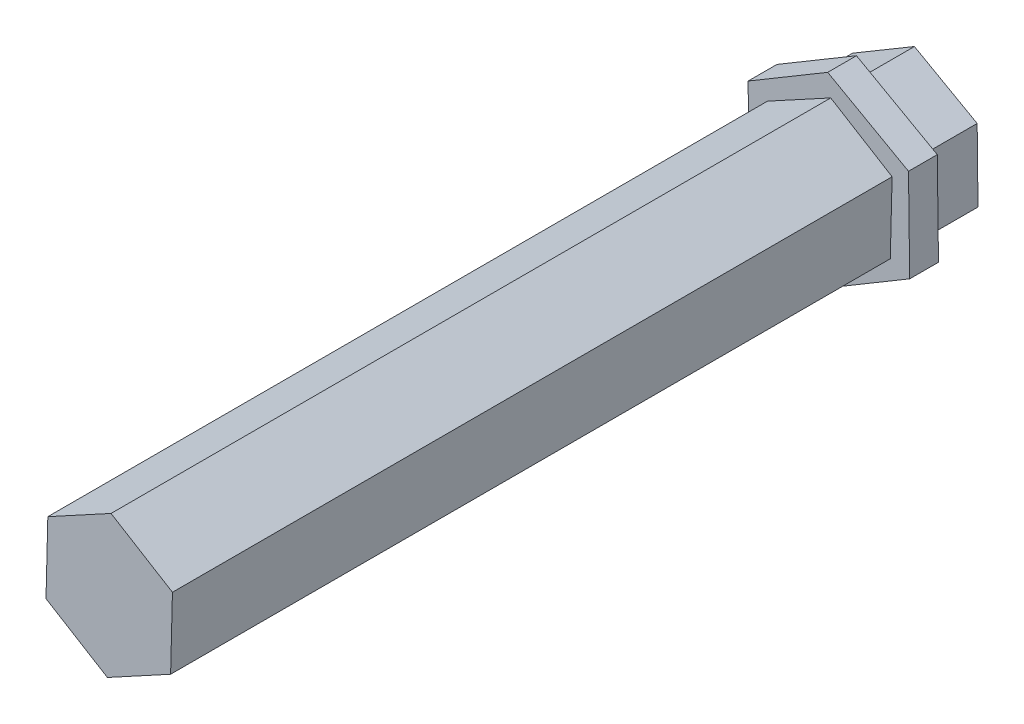
ISO-10303-21;
HEADER;
FILE_DESCRIPTION(('STEP AP214'),'2;1');
FILE_NAME('part.step','',(''),(''),'','','');
FILE_SCHEMA(('AUTOMOTIVE_DESIGN { 1 0 10303 214 1 1 1 1 }'));
ENDSEC;
DATA;
#1=APPLICATION_CONTEXT('core data for automotive mechanical design processes');
#2=APPLICATION_PROTOCOL_DEFINITION('international standard','automotive_design',2000,#1);
#3=PRODUCT_CONTEXT('',#1,'mechanical');
#4=PRODUCT('Part','Part','',(#3));
#5=PRODUCT_RELATED_PRODUCT_CATEGORY('part','',(#4));
#6=PRODUCT_DEFINITION_FORMATION('','',#4);
#7=PRODUCT_DEFINITION_CONTEXT('part definition',#1,'design');
#8=PRODUCT_DEFINITION('design','',#6,#7);
#9=PRODUCT_DEFINITION_SHAPE('','',#8);
#10=(LENGTH_UNIT() NAMED_UNIT(*) SI_UNIT(.MILLI.,.METRE.));
#11=(NAMED_UNIT(*) PLANE_ANGLE_UNIT() SI_UNIT($,.RADIAN.));
#12=(NAMED_UNIT(*) SI_UNIT($,.STERADIAN.) SOLID_ANGLE_UNIT());
#13=UNCERTAINTY_MEASURE_WITH_UNIT(LENGTH_MEASURE(1.E-05),#10,'distance_accuracy_value','');
#14=(GEOMETRIC_REPRESENTATION_CONTEXT(3) GLOBAL_UNCERTAINTY_ASSIGNED_CONTEXT((#13)) GLOBAL_UNIT_ASSIGNED_CONTEXT((#10,
#11,#12)) REPRESENTATION_CONTEXT('',''));
#15=CARTESIAN_POINT('',(0.,0.,0.));
#16=DIRECTION('',(0.,0.,1.));
#17=DIRECTION('',(1.,0.,0.));
#18=AXIS2_PLACEMENT_3D('',#15,#16,#17);
#19=CARTESIAN_POINT('',(-0.0633513319399213,-2.49919719284842,25.));
#20=DIRECTION('',(-0.477893893440263,0.878417569617381,0.));
#21=DIRECTION('',(-0.878417569617381,-0.477893893440263,0.));
#22=AXIS2_PLACEMENT_3D('',#19,#20,#21);
#23=PLANE('',#22);
#24=DIRECTION('',(0.878417569617381,0.477893893440263,0.));
#25=VECTOR('',#24,1.);
#26=CARTESIAN_POINT('',(-0.0633513319399213,-2.49919719284842,0.));
#27=LINE('',#26,#25);
#28=CARTESIAN_POINT('',(-0.0633513319399213,-2.49919719284842,0.));
#29=VERTEX_POINT('',#28);
#30=CARTESIAN_POINT('',(2.13269259210353,-1.30446245924777,0.));
#31=VERTEX_POINT('',#30);
#32=EDGE_CURVE('E133',#29,#31,#27,.T.);
#33=ORIENTED_EDGE('',*,*,#32,.T.);
#34=DIRECTION('',(0.,0.,-1.));
#35=VECTOR('',#34,1.);
#36=CARTESIAN_POINT('',(2.13269259210353,-1.30446245924777,25.));
#37=LINE('',#36,#35);
#38=CARTESIAN_POINT('',(2.13269259210353,-1.30446245924777,25.));
#39=VERTEX_POINT('',#38);
#40=EDGE_CURVE('E163',#39,#31,#37,.T.);
#41=ORIENTED_EDGE('',*,*,#40,.F.);
#42=DIRECTION('',(0.878417569617381,0.477893893440263,0.));
#43=VECTOR('',#42,1.);
#44=CARTESIAN_POINT('',(-0.0633513319399213,-2.49919719284842,25.));
#45=LINE('',#44,#43);
#46=CARTESIAN_POINT('',(-0.0633513319399213,-2.49919719284842,25.));
#47=VERTEX_POINT('',#46);
#48=EDGE_CURVE('E151',#47,#39,#45,.T.);
#49=ORIENTED_EDGE('',*,*,#48,.F.);
#50=DIRECTION('',(0.,0.,-1.));
#51=VECTOR('',#50,1.);
#52=CARTESIAN_POINT('',(-0.0633513319399213,-2.49919719284842,25.));
#53=LINE('',#52,#51);
#54=EDGE_CURVE('E129',#47,#29,#53,.T.);
#55=ORIENTED_EDGE('',*,*,#54,.T.);
#56=EDGE_LOOP('',(#33,#41,#49,#55));
#57=FACE_BOUND('',#56,.T.);
#58=ADVANCED_FACE('F39',(#57),#23,.F.);
#59=CARTESIAN_POINT('',(2.13269259210353,-1.30446245924777,25.));
#60=DIRECTION('',(-0.999678877139369,0.0253405327759691,0.));
#61=DIRECTION('',(-0.0253405327759691,-0.999678877139369,0.));
#62=AXIS2_PLACEMENT_3D('',#59,#60,#61);
#63=PLANE('',#62);
#64=DIRECTION('',(0.0253405327759691,0.999678877139369,0.));
#65=VECTOR('',#64,1.);
#66=CARTESIAN_POINT('',(2.13269259210353,-1.30446245924777,0.));
#67=LINE('',#66,#65);
#68=CARTESIAN_POINT('',(2.19604392404345,1.19473473360066,0.));
#69=VERTEX_POINT('',#68);
#70=EDGE_CURVE('E76',#31,#69,#67,.T.);
#71=ORIENTED_EDGE('',*,*,#70,.T.);
#72=DIRECTION('',(0.,0.,-1.));
#73=VECTOR('',#72,1.);
#74=CARTESIAN_POINT('',(2.19604392404345,1.19473473360066,25.));
#75=LINE('',#74,#73);
#76=CARTESIAN_POINT('',(2.19604392404345,1.19473473360066,25.));
#77=VERTEX_POINT('',#76);
#78=EDGE_CURVE('E159',#77,#69,#75,.T.);
#79=ORIENTED_EDGE('',*,*,#78,.F.);
#80=DIRECTION('',(0.0253405327759691,0.999678877139369,0.));
#81=VECTOR('',#80,1.);
#82=CARTESIAN_POINT('',(2.13269259210353,-1.30446245924777,25.));
#83=LINE('',#82,#81);
#84=EDGE_CURVE('E307',#39,#77,#83,.T.);
#85=ORIENTED_EDGE('',*,*,#84,.F.);
#86=ORIENTED_EDGE('',*,*,#40,.T.);
#87=EDGE_LOOP('',(#71,#79,#85,#86));
#88=FACE_BOUND('',#87,.T.);
#89=ADVANCED_FACE('F312',(#88),#63,.F.);
#90=CARTESIAN_POINT('',(2.19604392404345,1.19473473360066,25.));
#91=DIRECTION('',(-0.521784983699106,-0.853077036841412,0.));
#92=DIRECTION('',(0.853077036841412,-0.521784983699106,0.));
#93=AXIS2_PLACEMENT_3D('',#90,#91,#92);
#94=PLANE('',#93);
#95=DIRECTION('',(-0.853077036841412,0.521784983699106,0.));
#96=VECTOR('',#95,1.);
#97=CARTESIAN_POINT('',(2.19604392404345,1.19473473360066,0.));
#98=LINE('',#97,#96);
#99=CARTESIAN_POINT('',(0.0633513319399233,2.49919719284842,0.));
#100=VERTEX_POINT('',#99);
#101=EDGE_CURVE('E140',#69,#100,#98,.T.);
#102=ORIENTED_EDGE('',*,*,#101,.T.);
#103=DIRECTION('',(0.,0.,-1.));
#104=VECTOR('',#103,1.);
#105=CARTESIAN_POINT('',(0.0633513319399233,2.49919719284842,25.));
#106=LINE('',#105,#104);
#107=CARTESIAN_POINT('',(0.0633513319399233,2.49919719284842,25.));
#108=VERTEX_POINT('',#107);
#109=EDGE_CURVE('E122',#108,#100,#106,.T.);
#110=ORIENTED_EDGE('',*,*,#109,.F.);
#111=DIRECTION('',(-0.853077036841412,0.521784983699106,0.));
#112=VECTOR('',#111,1.);
#113=CARTESIAN_POINT('',(2.19604392404345,1.19473473360066,25.));
#114=LINE('',#113,#112);
#115=EDGE_CURVE('E107',#77,#108,#114,.T.);
#116=ORIENTED_EDGE('',*,*,#115,.F.);
#117=ORIENTED_EDGE('',*,*,#78,.T.);
#118=EDGE_LOOP('',(#102,#110,#116,#117));
#119=FACE_BOUND('',#118,.T.);
#120=ADVANCED_FACE('F314',(#119),#94,.F.);
#121=CARTESIAN_POINT('',(0.0633513319399233,2.49919719284842,25.));
#122=DIRECTION('',(0.477893893440263,-0.878417569617381,0.));
#123=DIRECTION('',(0.878417569617381,0.477893893440263,0.));
#124=AXIS2_PLACEMENT_3D('',#121,#122,#123);
#125=PLANE('',#124);
#126=DIRECTION('',(-0.878417569617381,-0.477893893440263,0.));
#127=VECTOR('',#126,1.);
#128=CARTESIAN_POINT('',(0.0633513319399233,2.49919719284842,0.));
#129=LINE('',#128,#127);
#130=CARTESIAN_POINT('',(-2.13269259210353,1.30446245924777,0.));
#131=VERTEX_POINT('',#130);
#132=EDGE_CURVE('E118',#100,#131,#129,.T.);
#133=ORIENTED_EDGE('',*,*,#132,.T.);
#134=DIRECTION('',(0.,0.,-1.));
#135=VECTOR('',#134,1.);
#136=CARTESIAN_POINT('',(-2.13269259210353,1.30446245924777,25.));
#137=LINE('',#136,#135);
#138=CARTESIAN_POINT('',(-2.13269259210353,1.30446245924777,25.));
#139=VERTEX_POINT('',#138);
#140=EDGE_CURVE('E115',#139,#131,#137,.T.);
#141=ORIENTED_EDGE('',*,*,#140,.F.);
#142=DIRECTION('',(-0.878417569617381,-0.477893893440263,0.));
#143=VECTOR('',#142,1.);
#144=CARTESIAN_POINT('',(0.0633513319399233,2.49919719284842,25.));
#145=LINE('',#144,#143);
#146=EDGE_CURVE('E100',#108,#139,#145,.T.);
#147=ORIENTED_EDGE('',*,*,#146,.F.);
#148=ORIENTED_EDGE('',*,*,#109,.T.);
#149=EDGE_LOOP('',(#133,#141,#147,#148));
#150=FACE_BOUND('',#149,.T.);
#151=ADVANCED_FACE('F116',(#150),#125,.F.);
#152=CARTESIAN_POINT('',(-2.13269259210353,1.30446245924777,25.));
#153=DIRECTION('',(0.999678877139369,-0.0253405327759693,0.));
#154=DIRECTION('',(0.0253405327759693,0.999678877139369,0.));
#155=AXIS2_PLACEMENT_3D('',#152,#153,#154);
#156=PLANE('',#155);
#157=DIRECTION('',(-0.0253405327759692,-0.999678877139369,0.));
#158=VECTOR('',#157,1.);
#159=CARTESIAN_POINT('',(-2.13269259210353,1.30446245924777,0.));
#160=LINE('',#159,#158);
#161=CARTESIAN_POINT('',(-2.19604392404345,-1.19473473360066,0.));
#162=VERTEX_POINT('',#161);
#163=EDGE_CURVE('E146',#131,#162,#160,.T.);
#164=ORIENTED_EDGE('',*,*,#163,.T.);
#165=DIRECTION('',(0.,0.,-1.));
#166=VECTOR('',#165,1.);
#167=CARTESIAN_POINT('',(-2.19604392404345,-1.19473473360066,25.));
#168=LINE('',#167,#166);
#169=CARTESIAN_POINT('',(-2.19604392404345,-1.19473473360066,25.));
#170=VERTEX_POINT('',#169);
#171=EDGE_CURVE('E123',#170,#162,#168,.T.);
#172=ORIENTED_EDGE('',*,*,#171,.F.);
#173=DIRECTION('',(-0.0253405327759692,-0.999678877139369,0.));
#174=VECTOR('',#173,1.);
#175=CARTESIAN_POINT('',(-2.13269259210353,1.30446245924777,25.));
#176=LINE('',#175,#174);
#177=EDGE_CURVE('E104',#139,#170,#176,.T.);
#178=ORIENTED_EDGE('',*,*,#177,.F.);
#179=ORIENTED_EDGE('',*,*,#140,.T.);
#180=EDGE_LOOP('',(#164,#172,#178,#179));
#181=FACE_BOUND('',#180,.T.);
#182=ADVANCED_FACE('F125',(#181),#156,.F.);
#183=CARTESIAN_POINT('',(-2.19604392404345,-1.19473473360066,25.));
#184=DIRECTION('',(0.521784983699106,0.853077036841412,0.));
#185=DIRECTION('',(-0.853077036841412,0.521784983699106,0.));
#186=AXIS2_PLACEMENT_3D('',#183,#184,#185);
#187=PLANE('',#186);
#188=DIRECTION('',(0.853077036841412,-0.521784983699106,0.));
#189=VECTOR('',#188,1.);
#190=CARTESIAN_POINT('',(-2.19604392404345,-1.19473473360066,0.));
#191=LINE('',#190,#189);
#192=EDGE_CURVE('E87',#162,#29,#191,.T.);
#193=ORIENTED_EDGE('',*,*,#192,.T.);
#194=ORIENTED_EDGE('',*,*,#54,.F.);
#195=DIRECTION('',(0.853077036841412,-0.521784983699106,0.));
#196=VECTOR('',#195,1.);
#197=CARTESIAN_POINT('',(-2.19604392404345,-1.19473473360066,25.));
#198=LINE('',#197,#196);
#199=EDGE_CURVE('E63',#170,#47,#198,.T.);
#200=ORIENTED_EDGE('',*,*,#199,.F.);
#201=ORIENTED_EDGE('',*,*,#171,.T.);
#202=EDGE_LOOP('',(#193,#194,#200,#201));
#203=FACE_BOUND('',#202,.T.);
#204=ADVANCED_FACE('F413',(#203),#187,.F.);
#205=CARTESIAN_POINT('',(0.,0.,25.));
#206=DIRECTION('',(0.,0.,1.));
#207=DIRECTION('',(1.,0.,0.));
#208=AXIS2_PLACEMENT_3D('',#205,#206,#207);
#209=PLANE('',#208);
#210=ORIENTED_EDGE('',*,*,#48,.T.);
#211=ORIENTED_EDGE('',*,*,#84,.T.);
#212=ORIENTED_EDGE('',*,*,#115,.T.);
#213=ORIENTED_EDGE('',*,*,#146,.T.);
#214=ORIENTED_EDGE('',*,*,#177,.T.);
#215=ORIENTED_EDGE('',*,*,#199,.T.);
#216=EDGE_LOOP('',(#210,#211,#212,#213,#214,#215));
#217=FACE_BOUND('',#216,.T.);
#218=ADVANCED_FACE('F102',(#217),#209,.T.);
#219=CARTESIAN_POINT('',(0.,0.,0.));
#220=DIRECTION('',(0.,0.,1.));
#221=DIRECTION('',(1.,0.,0.));
#222=AXIS2_PLACEMENT_3D('',#219,#220,#221);
#223=PLANE('',#222);
#224=ORIENTED_EDGE('',*,*,#192,.F.);
#225=ORIENTED_EDGE('',*,*,#163,.F.);
#226=ORIENTED_EDGE('',*,*,#132,.F.);
#227=ORIENTED_EDGE('',*,*,#101,.F.);
#228=ORIENTED_EDGE('',*,*,#70,.F.);
#229=ORIENTED_EDGE('',*,*,#32,.F.);
#230=EDGE_LOOP('',(#224,#225,#226,#227,#228,#229));
#231=FACE_BOUND('',#230,.T.);
#232=DIRECTION('',(0.859492618774005,0.511148156871374,0.));
#233=VECTOR('',#232,1.);
#234=CARTESIAN_POINT('',(0.0415689398174787,-3.21689771838971,0.));
#235=LINE('',#234,#233);
#236=CARTESIAN_POINT('',(0.0415689398174787,-3.21689771838971,0.));
#237=VERTEX_POINT('',#236);
#238=CARTESIAN_POINT('',(2.80669961541042,-1.57244910130453,0.));
#239=VERTEX_POINT('',#238);
#240=EDGE_CURVE('E219',#237,#239,#235,.T.);
#241=ORIENTED_EDGE('',*,*,#240,.T.);
#242=DIRECTION('',(-0.0129209795612006,0.999916520659189,0.));
#243=VECTOR('',#242,1.);
#244=CARTESIAN_POINT('',(2.80669961541042,-1.57244910130453,0.));
#245=LINE('',#244,#243);
#246=CARTESIAN_POINT('',(2.76513067559294,1.64444861708518,0.));
#247=VERTEX_POINT('',#246);
#248=EDGE_CURVE('E264',#239,#247,#245,.T.);
#249=ORIENTED_EDGE('',*,*,#248,.T.);
#250=DIRECTION('',(-0.872413598335205,0.488768363787816,0.));
#251=VECTOR('',#250,1.);
#252=CARTESIAN_POINT('',(2.76513067559294,1.64444861708518,0.));
#253=LINE('',#252,#251);
#254=CARTESIAN_POINT('',(-0.0415689398174778,3.21689771838971,0.));
#255=VERTEX_POINT('',#254);
#256=EDGE_CURVE('E268',#247,#255,#253,.T.);
#257=ORIENTED_EDGE('',*,*,#256,.T.);
#258=DIRECTION('',(-0.859492618774006,-0.511148156871373,0.));
#259=VECTOR('',#258,1.);
#260=CARTESIAN_POINT('',(-0.0415689398174778,3.21689771838971,0.));
#261=LINE('',#260,#259);
#262=CARTESIAN_POINT('',(-2.80669961541042,1.57244910130453,0.));
#263=VERTEX_POINT('',#262);
#264=EDGE_CURVE('E272',#255,#263,#261,.T.);
#265=ORIENTED_EDGE('',*,*,#264,.T.);
#266=DIRECTION('',(0.0129209795611999,-0.999916520659189,0.));
#267=VECTOR('',#266,1.);
#268=CARTESIAN_POINT('',(-2.80669961541042,1.57244910130453,0.));
#269=LINE('',#268,#267);
#270=CARTESIAN_POINT('',(-2.76513067559294,-1.64444861708517,0.));
#271=VERTEX_POINT('',#270);
#272=EDGE_CURVE('E276',#263,#271,#269,.T.);
#273=ORIENTED_EDGE('',*,*,#272,.T.);
#274=DIRECTION('',(0.872413598335205,-0.488768363787816,0.));
#275=VECTOR('',#274,1.);
#276=CARTESIAN_POINT('',(-2.76513067559294,-1.64444861708517,0.));
#277=LINE('',#276,#275);
#278=EDGE_CURVE('E240',#271,#237,#277,.T.);
#279=ORIENTED_EDGE('',*,*,#278,.T.);
#280=EDGE_LOOP('',(#241,#249,#257,#265,#273,#279));
#281=FACE_BOUND('',#280,.T.);
#282=ADVANCED_FACE('F411',(#231,#281),#223,.T.);
#283=CARTESIAN_POINT('',(0.0415689398174787,-3.21689771838971,-1.));
#284=DIRECTION('',(0.511148156871374,-0.859492618774005,0.));
#285=DIRECTION('',(0.859492618774005,0.511148156871374,0.));
#286=AXIS2_PLACEMENT_3D('',#283,#284,#285);
#287=PLANE('',#286);
#288=ORIENTED_EDGE('',*,*,#240,.F.);
#289=DIRECTION('',(0.,0.,1.));
#290=VECTOR('',#289,1.);
#291=CARTESIAN_POINT('',(0.0415689398174787,-3.21689771838971,-1.));
#292=LINE('',#291,#290);
#293=CARTESIAN_POINT('',(0.0415689398174787,-3.21689771838971,-1.));
#294=VERTEX_POINT('',#293);
#295=EDGE_CURVE('E137',#294,#237,#292,.T.);
#296=ORIENTED_EDGE('',*,*,#295,.F.);
#297=DIRECTION('',(0.859492618774005,0.511148156871374,0.));
#298=VECTOR('',#297,1.);
#299=CARTESIAN_POINT('',(0.0415689398174787,-3.21689771838971,-1.));
#300=LINE('',#299,#298);
#301=CARTESIAN_POINT('',(2.80669961541042,-1.57244910130453,-1.));
#302=VERTEX_POINT('',#301);
#303=EDGE_CURVE('E235',#294,#302,#300,.T.);
#304=ORIENTED_EDGE('',*,*,#303,.T.);
#305=DIRECTION('',(0.,0.,1.));
#306=VECTOR('',#305,1.);
#307=CARTESIAN_POINT('',(2.80669961541042,-1.57244910130453,-1.));
#308=LINE('',#307,#306);
#309=EDGE_CURVE('E260',#302,#239,#308,.T.);
#310=ORIENTED_EDGE('',*,*,#309,.T.);
#311=EDGE_LOOP('',(#288,#296,#304,#310));
#312=FACE_BOUND('',#311,.T.);
#313=ADVANCED_FACE('F453',(#312),#287,.T.);
#314=CARTESIAN_POINT('',(-2.76513067559294,-1.64444861708517,-1.));
#315=DIRECTION('',(-0.488768363787816,-0.872413598335205,0.));
#316=DIRECTION('',(0.872413598335205,-0.488768363787816,0.));
#317=AXIS2_PLACEMENT_3D('',#314,#315,#316);
#318=PLANE('',#317);
#319=ORIENTED_EDGE('',*,*,#278,.F.);
#320=DIRECTION('',(0.,0.,1.));
#321=VECTOR('',#320,1.);
#322=CARTESIAN_POINT('',(-2.76513067559294,-1.64444861708517,-1.));
#323=LINE('',#322,#321);
#324=CARTESIAN_POINT('',(-2.76513067559294,-1.64444861708517,-1.));
#325=VERTEX_POINT('',#324);
#326=EDGE_CURVE('E286',#325,#271,#323,.T.);
#327=ORIENTED_EDGE('',*,*,#326,.F.);
#328=DIRECTION('',(0.872413598335205,-0.488768363787816,0.));
#329=VECTOR('',#328,1.);
#330=CARTESIAN_POINT('',(-2.76513067559294,-1.64444861708517,-1.));
#331=LINE('',#330,#329);
#332=EDGE_CURVE('E256',#325,#294,#331,.T.);
#333=ORIENTED_EDGE('',*,*,#332,.T.);
#334=ORIENTED_EDGE('',*,*,#295,.T.);
#335=EDGE_LOOP('',(#319,#327,#333,#334));
#336=FACE_BOUND('',#335,.T.);
#337=ADVANCED_FACE('F519',(#336),#318,.T.);
#338=CARTESIAN_POINT('',(-2.80669961541042,1.57244910130453,-1.));
#339=DIRECTION('',(-0.999916520659189,-0.0129209795611999,0.));
#340=DIRECTION('',(0.0129209795611999,-0.999916520659189,0.));
#341=AXIS2_PLACEMENT_3D('',#338,#339,#340);
#342=PLANE('',#341);
#343=ORIENTED_EDGE('',*,*,#272,.F.);
#344=DIRECTION('',(0.,0.,1.));
#345=VECTOR('',#344,1.);
#346=CARTESIAN_POINT('',(-2.80669961541042,1.57244910130453,-1.));
#347=LINE('',#346,#345);
#348=CARTESIAN_POINT('',(-2.80669961541042,1.57244910130453,-1.));
#349=VERTEX_POINT('',#348);
#350=EDGE_CURVE('E290',#349,#263,#347,.T.);
#351=ORIENTED_EDGE('',*,*,#350,.F.);
#352=DIRECTION('',(0.0129209795611999,-0.999916520659189,0.));
#353=VECTOR('',#352,1.);
#354=CARTESIAN_POINT('',(-2.80669961541042,1.57244910130453,-1.));
#355=LINE('',#354,#353);
#356=EDGE_CURVE('E252',#349,#325,#355,.T.);
#357=ORIENTED_EDGE('',*,*,#356,.T.);
#358=ORIENTED_EDGE('',*,*,#326,.T.);
#359=EDGE_LOOP('',(#343,#351,#357,#358));
#360=FACE_BOUND('',#359,.T.);
#361=ADVANCED_FACE('F522',(#360),#342,.T.);
#362=CARTESIAN_POINT('',(-0.0415689398174778,3.21689771838971,-1.));
#363=DIRECTION('',(-0.511148156871373,0.859492618774006,0.));
#364=DIRECTION('',(-0.859492618774006,-0.511148156871373,0.));
#365=AXIS2_PLACEMENT_3D('',#362,#363,#364);
#366=PLANE('',#365);
#367=ORIENTED_EDGE('',*,*,#264,.F.);
#368=DIRECTION('',(0.,0.,1.));
#369=VECTOR('',#368,1.);
#370=CARTESIAN_POINT('',(-0.0415689398174778,3.21689771838971,-1.));
#371=LINE('',#370,#369);
#372=CARTESIAN_POINT('',(-0.0415689398174778,3.21689771838971,-1.));
#373=VERTEX_POINT('',#372);
#374=EDGE_CURVE('E294',#373,#255,#371,.T.);
#375=ORIENTED_EDGE('',*,*,#374,.F.);
#376=DIRECTION('',(-0.859492618774006,-0.511148156871373,0.));
#377=VECTOR('',#376,1.);
#378=CARTESIAN_POINT('',(-0.0415689398174778,3.21689771838971,-1.));
#379=LINE('',#378,#377);
#380=EDGE_CURVE('E248',#373,#349,#379,.T.);
#381=ORIENTED_EDGE('',*,*,#380,.T.);
#382=ORIENTED_EDGE('',*,*,#350,.T.);
#383=EDGE_LOOP('',(#367,#375,#381,#382));
#384=FACE_BOUND('',#383,.T.);
#385=ADVANCED_FACE('F526',(#384),#366,.T.);
#386=CARTESIAN_POINT('',(2.76513067559294,1.64444861708518,-1.));
#387=DIRECTION('',(0.488768363787816,0.872413598335205,0.));
#388=DIRECTION('',(-0.872413598335205,0.488768363787816,0.));
#389=AXIS2_PLACEMENT_3D('',#386,#387,#388);
#390=PLANE('',#389);
#391=ORIENTED_EDGE('',*,*,#256,.F.);
#392=DIRECTION('',(0.,0.,1.));
#393=VECTOR('',#392,1.);
#394=CARTESIAN_POINT('',(2.76513067559294,1.64444861708518,-1.));
#395=LINE('',#394,#393);
#396=CARTESIAN_POINT('',(2.76513067559294,1.64444861708518,-1.));
#397=VERTEX_POINT('',#396);
#398=EDGE_CURVE('E298',#397,#247,#395,.T.);
#399=ORIENTED_EDGE('',*,*,#398,.F.);
#400=DIRECTION('',(-0.872413598335205,0.488768363787816,0.));
#401=VECTOR('',#400,1.);
#402=CARTESIAN_POINT('',(2.76513067559294,1.64444861708518,-1.));
#403=LINE('',#402,#401);
#404=EDGE_CURVE('E244',#397,#373,#403,.T.);
#405=ORIENTED_EDGE('',*,*,#404,.T.);
#406=ORIENTED_EDGE('',*,*,#374,.T.);
#407=EDGE_LOOP('',(#391,#399,#405,#406));
#408=FACE_BOUND('',#407,.T.);
#409=ADVANCED_FACE('F530',(#408),#390,.T.);
#410=CARTESIAN_POINT('',(2.80669961541042,-1.57244910130453,-1.));
#411=DIRECTION('',(0.999916520659189,0.0129209795612006,0.));
#412=DIRECTION('',(-0.0129209795612006,0.999916520659189,0.));
#413=AXIS2_PLACEMENT_3D('',#410,#411,#412);
#414=PLANE('',#413);
#415=ORIENTED_EDGE('',*,*,#248,.F.);
#416=ORIENTED_EDGE('',*,*,#309,.F.);
#417=DIRECTION('',(-0.0129209795612006,0.999916520659189,0.));
#418=VECTOR('',#417,1.);
#419=CARTESIAN_POINT('',(2.80669961541042,-1.57244910130453,-1.));
#420=LINE('',#419,#418);
#421=EDGE_CURVE('E239',#302,#397,#420,.T.);
#422=ORIENTED_EDGE('',*,*,#421,.T.);
#423=ORIENTED_EDGE('',*,*,#398,.T.);
#424=EDGE_LOOP('',(#415,#416,#422,#423));
#425=FACE_BOUND('',#424,.T.);
#426=ADVANCED_FACE('F464',(#425),#414,.T.);
#427=CARTESIAN_POINT('',(0.,0.,-1.));
#428=DIRECTION('',(0.,0.,1.));
#429=DIRECTION('',(1.,0.,0.));
#430=AXIS2_PLACEMENT_3D('',#427,#428,#429);
#431=PLANE('',#430);
#432=DIRECTION('',(-0.860154789809173,-0.510033074974886,0.));
#433=VECTOR('',#432,1.);
#434=CARTESIAN_POINT('',(-1.10425399924636,1.86228974790402,-1.));
#435=LINE('',#434,#433);
#436=CARTESIAN_POINT('',(-0.0290605119848948,2.49983109162263,-1.));
#437=VERTEX_POINT('',#436);
#438=CARTESIAN_POINT('',(-2.17944748650783,1.22474840418541,-1.));
#439=VERTEX_POINT('',#438);
#440=EDGE_CURVE('E47',#437,#439,#435,.T.);
#441=ORIENTED_EDGE('',*,*,#440,.T.);
#442=DIRECTION('',(0.011624204793958,-0.999932436649051,0.));
#443=VECTOR('',#442,1.);
#444=CARTESIAN_POINT('',(-2.16491723051538,-0.0251671416259013,-1.));
#445=LINE('',#444,#443);
#446=CARTESIAN_POINT('',(-2.15038697452293,-1.27508268743721,-1.));
#447=VERTEX_POINT('',#446);
#448=EDGE_CURVE('E11',#439,#447,#445,.T.);
#449=ORIENTED_EDGE('',*,*,#448,.T.);
#450=DIRECTION('',(0.871778994603131,-0.489899361674165,0.));
#451=VECTOR('',#450,1.);
#452=CARTESIAN_POINT('',(-1.06066323126902,-1.88745688952992,-1.));
#453=LINE('',#452,#451);
#454=CARTESIAN_POINT('',(0.0290605119848955,-2.49983109162263,-1.));
#455=VERTEX_POINT('',#454);
#456=EDGE_CURVE('E166',#447,#455,#453,.T.);
#457=ORIENTED_EDGE('',*,*,#456,.T.);
#458=DIRECTION('',(0.860154789809173,0.510033074974886,0.));
#459=VECTOR('',#458,1.);
#460=CARTESIAN_POINT('',(1.10425399924636,-1.86228974790402,-1.));
#461=LINE('',#460,#459);
#462=CARTESIAN_POINT('',(2.17944748650783,-1.22474840418541,-1.));
#463=VERTEX_POINT('',#462);
#464=EDGE_CURVE('E170',#455,#463,#461,.T.);
#465=ORIENTED_EDGE('',*,*,#464,.T.);
#466=DIRECTION('',(-0.0116242047939585,0.999932436649051,0.));
#467=VECTOR('',#466,1.);
#468=CARTESIAN_POINT('',(2.16491723051538,0.0251671416259024,-1.));
#469=LINE('',#468,#467);
#470=CARTESIAN_POINT('',(2.15038697452293,1.27508268743722,-1.));
#471=VERTEX_POINT('',#470);
#472=EDGE_CURVE('E174',#463,#471,#469,.T.);
#473=ORIENTED_EDGE('',*,*,#472,.T.);
#474=DIRECTION('',(-0.871778994603131,0.489899361674165,0.));
#475=VECTOR('',#474,1.);
#476=CARTESIAN_POINT('',(1.06066323126902,1.88745688952992,-1.));
#477=LINE('',#476,#475);
#478=EDGE_CURVE('E178',#471,#437,#477,.T.);
#479=ORIENTED_EDGE('',*,*,#478,.T.);
#480=EDGE_LOOP('',(#441,#449,#457,#465,#473,#479));
#481=FACE_BOUND('',#480,.T.);
#482=ORIENTED_EDGE('',*,*,#303,.F.);
#483=ORIENTED_EDGE('',*,*,#332,.F.);
#484=ORIENTED_EDGE('',*,*,#356,.F.);
#485=ORIENTED_EDGE('',*,*,#380,.F.);
#486=ORIENTED_EDGE('',*,*,#404,.F.);
#487=ORIENTED_EDGE('',*,*,#421,.F.);
#488=EDGE_LOOP('',(#482,#483,#484,#485,#486,#487));
#489=FACE_BOUND('',#488,.T.);
#490=ADVANCED_FACE('F186',(#481,#489),#431,.F.);
#491=CARTESIAN_POINT('',(-2.17944748650783,1.22474840418541,-3.));
#492=DIRECTION('',(-0.999932436649051,-0.011624204793958,0.));
#493=DIRECTION('',(0.011624204793958,-0.999932436649051,0.));
#494=AXIS2_PLACEMENT_3D('',#491,#492,#493);
#495=PLANE('',#494);
#496=ORIENTED_EDGE('',*,*,#448,.F.);
#497=DIRECTION('',(0.,0.,1.));
#498=VECTOR('',#497,1.);
#499=CARTESIAN_POINT('',(-2.17944748650783,1.22474840418541,-3.));
#500=LINE('',#499,#498);
#501=CARTESIAN_POINT('',(-2.17944748650783,1.22474840418541,-3.));
#502=VERTEX_POINT('',#501);
#503=EDGE_CURVE('E204',#502,#439,#500,.T.);
#504=ORIENTED_EDGE('',*,*,#503,.F.);
#505=DIRECTION('',(0.011624204793958,-0.999932436649051,0.));
#506=VECTOR('',#505,1.);
#507=CARTESIAN_POINT('',(-2.17944748650783,1.22474840418541,-3.));
#508=LINE('',#507,#506);
#509=CARTESIAN_POINT('',(-2.15038697452293,-1.27508268743721,-3.));
#510=VERTEX_POINT('',#509);
#511=EDGE_CURVE('E375',#502,#510,#508,.T.);
#512=ORIENTED_EDGE('',*,*,#511,.T.);
#513=DIRECTION('',(0.,0.,1.));
#514=VECTOR('',#513,1.);
#515=CARTESIAN_POINT('',(-2.15038697452293,-1.27508268743721,-3.));
#516=LINE('',#515,#514);
#517=EDGE_CURVE('E230',#510,#447,#516,.T.);
#518=ORIENTED_EDGE('',*,*,#517,.T.);
#519=EDGE_LOOP('',(#496,#504,#512,#518));
#520=FACE_BOUND('',#519,.T.);
#521=ADVANCED_FACE('F381',(#520),#495,.T.);
#522=CARTESIAN_POINT('',(-0.0290605119848948,2.49983109162263,-3.));
#523=DIRECTION('',(-0.510033074974886,0.860154789809173,0.));
#524=DIRECTION('',(-0.860154789809173,-0.510033074974886,0.));
#525=AXIS2_PLACEMENT_3D('',#522,#523,#524);
#526=PLANE('',#525);
#527=ORIENTED_EDGE('',*,*,#440,.F.);
#528=DIRECTION('',(0.,0.,1.));
#529=VECTOR('',#528,1.);
#530=CARTESIAN_POINT('',(-0.0290605119848948,2.49983109162263,-3.));
#531=LINE('',#530,#529);
#532=CARTESIAN_POINT('',(-0.0290605119848948,2.49983109162263,-3.));
#533=VERTEX_POINT('',#532);
#534=EDGE_CURVE('E201',#533,#437,#531,.T.);
#535=ORIENTED_EDGE('',*,*,#534,.F.);
#536=DIRECTION('',(-0.860154789809173,-0.510033074974886,0.));
#537=VECTOR('',#536,1.);
#538=CARTESIAN_POINT('',(-0.0290605119848948,2.49983109162263,-3.));
#539=LINE('',#538,#537);
#540=EDGE_CURVE('E234',#533,#502,#539,.T.);
#541=ORIENTED_EDGE('',*,*,#540,.T.);
#542=ORIENTED_EDGE('',*,*,#503,.T.);
#543=EDGE_LOOP('',(#527,#535,#541,#542));
#544=FACE_BOUND('',#543,.T.);
#545=ADVANCED_FACE('F198',(#544),#526,.T.);
#546=CARTESIAN_POINT('',(2.15038697452293,1.27508268743722,-3.));
#547=DIRECTION('',(0.489899361674165,0.871778994603131,0.));
#548=DIRECTION('',(-0.871778994603131,0.489899361674165,0.));
#549=AXIS2_PLACEMENT_3D('',#546,#547,#548);
#550=PLANE('',#549);
#551=ORIENTED_EDGE('',*,*,#478,.F.);
#552=DIRECTION('',(0.,0.,1.));
#553=VECTOR('',#552,1.);
#554=CARTESIAN_POINT('',(2.15038697452293,1.27508268743722,-3.));
#555=LINE('',#554,#553);
#556=CARTESIAN_POINT('',(2.15038697452293,1.27508268743722,-3.));
#557=VERTEX_POINT('',#556);
#558=EDGE_CURVE('E215',#557,#471,#555,.T.);
#559=ORIENTED_EDGE('',*,*,#558,.F.);
#560=DIRECTION('',(-0.871778994603131,0.489899361674165,0.));
#561=VECTOR('',#560,1.);
#562=CARTESIAN_POINT('',(2.15038697452293,1.27508268743722,-3.));
#563=LINE('',#562,#561);
#564=EDGE_CURVE('E212',#557,#533,#563,.T.);
#565=ORIENTED_EDGE('',*,*,#564,.T.);
#566=ORIENTED_EDGE('',*,*,#534,.T.);
#567=EDGE_LOOP('',(#551,#559,#565,#566));
#568=FACE_BOUND('',#567,.T.);
#569=ADVANCED_FACE('F208',(#568),#550,.T.);
#570=CARTESIAN_POINT('',(2.17944748650783,-1.22474840418541,-3.));
#571=DIRECTION('',(0.999932436649051,0.0116242047939585,0.));
#572=DIRECTION('',(-0.0116242047939585,0.999932436649051,0.));
#573=AXIS2_PLACEMENT_3D('',#570,#571,#572);
#574=PLANE('',#573);
#575=ORIENTED_EDGE('',*,*,#472,.F.);
#576=DIRECTION('',(0.,0.,1.));
#577=VECTOR('',#576,1.);
#578=CARTESIAN_POINT('',(2.17944748650783,-1.22474840418541,-3.));
#579=LINE('',#578,#577);
#580=CARTESIAN_POINT('',(2.17944748650783,-1.22474840418541,-3.));
#581=VERTEX_POINT('',#580);
#582=EDGE_CURVE('E221',#581,#463,#579,.T.);
#583=ORIENTED_EDGE('',*,*,#582,.F.);
#584=DIRECTION('',(-0.0116242047939585,0.999932436649051,0.));
#585=VECTOR('',#584,1.);
#586=CARTESIAN_POINT('',(2.17944748650783,-1.22474840418541,-3.));
#587=LINE('',#586,#585);
#588=EDGE_CURVE('E387',#581,#557,#587,.T.);
#589=ORIENTED_EDGE('',*,*,#588,.T.);
#590=ORIENTED_EDGE('',*,*,#558,.T.);
#591=EDGE_LOOP('',(#575,#583,#589,#590));
#592=FACE_BOUND('',#591,.T.);
#593=ADVANCED_FACE('F394',(#592),#574,.T.);
#594=CARTESIAN_POINT('',(0.0290605119848955,-2.49983109162263,-3.));
#595=DIRECTION('',(0.510033074974886,-0.860154789809173,0.));
#596=DIRECTION('',(0.860154789809173,0.510033074974886,0.));
#597=AXIS2_PLACEMENT_3D('',#594,#595,#596);
#598=PLANE('',#597);
#599=ORIENTED_EDGE('',*,*,#464,.F.);
#600=DIRECTION('',(0.,0.,1.));
#601=VECTOR('',#600,1.);
#602=CARTESIAN_POINT('',(0.0290605119848955,-2.49983109162263,-3.));
#603=LINE('',#602,#601);
#604=CARTESIAN_POINT('',(0.0290605119848955,-2.49983109162263,-3.));
#605=VERTEX_POINT('',#604);
#606=EDGE_CURVE('E54',#605,#455,#603,.T.);
#607=ORIENTED_EDGE('',*,*,#606,.F.);
#608=DIRECTION('',(0.860154789809173,0.510033074974886,0.));
#609=VECTOR('',#608,1.);
#610=CARTESIAN_POINT('',(0.0290605119848955,-2.49983109162263,-3.));
#611=LINE('',#610,#609);
#612=EDGE_CURVE('E378',#605,#581,#611,.T.);
#613=ORIENTED_EDGE('',*,*,#612,.T.);
#614=ORIENTED_EDGE('',*,*,#582,.T.);
#615=EDGE_LOOP('',(#599,#607,#613,#614));
#616=FACE_BOUND('',#615,.T.);
#617=ADVANCED_FACE('F396',(#616),#598,.T.);
#618=CARTESIAN_POINT('',(-2.15038697452293,-1.27508268743721,-3.));
#619=DIRECTION('',(-0.489899361674165,-0.871778994603131,0.));
#620=DIRECTION('',(0.871778994603131,-0.489899361674165,0.));
#621=AXIS2_PLACEMENT_3D('',#618,#619,#620);
#622=PLANE('',#621);
#623=ORIENTED_EDGE('',*,*,#456,.F.);
#624=ORIENTED_EDGE('',*,*,#517,.F.);
#625=DIRECTION('',(0.871778994603131,-0.489899361674165,0.));
#626=VECTOR('',#625,1.);
#627=CARTESIAN_POINT('',(-2.15038697452293,-1.27508268743721,-3.));
#628=LINE('',#627,#626);
#629=EDGE_CURVE('E368',#510,#605,#628,.T.);
#630=ORIENTED_EDGE('',*,*,#629,.T.);
#631=ORIENTED_EDGE('',*,*,#606,.T.);
#632=EDGE_LOOP('',(#623,#624,#630,#631));
#633=FACE_BOUND('',#632,.T.);
#634=ADVANCED_FACE('F367',(#633),#622,.T.);
#635=CARTESIAN_POINT('',(0.,0.,-3.));
#636=DIRECTION('',(0.,0.,1.));
#637=DIRECTION('',(1.,0.,0.));
#638=AXIS2_PLACEMENT_3D('',#635,#636,#637);
#639=PLANE('',#638);
#640=ORIENTED_EDGE('',*,*,#511,.F.);
#641=ORIENTED_EDGE('',*,*,#540,.F.);
#642=ORIENTED_EDGE('',*,*,#564,.F.);
#643=ORIENTED_EDGE('',*,*,#588,.F.);
#644=ORIENTED_EDGE('',*,*,#612,.F.);
#645=ORIENTED_EDGE('',*,*,#629,.F.);
#646=EDGE_LOOP('',(#640,#641,#642,#643,#644,#645));
#647=FACE_BOUND('',#646,.T.);
#648=ADVANCED_FACE('F374',(#647),#639,.F.);
#649=CLOSED_SHELL('',(#58,#89,#120,#151,#182,#204,#218,#282,#313,#337,#361,#385,#409,#426,#490,
#521,#545,#569,#593,#617,#634,#648));
#650=MANIFOLD_SOLID_BREP('B2',#649);
#651=ADVANCED_BREP_SHAPE_REPRESENTATION('',(#18,#650),#14);
#652=SHAPE_DEFINITION_REPRESENTATION(#9,#651);
ENDSEC;
END-ISO-10303-21;
